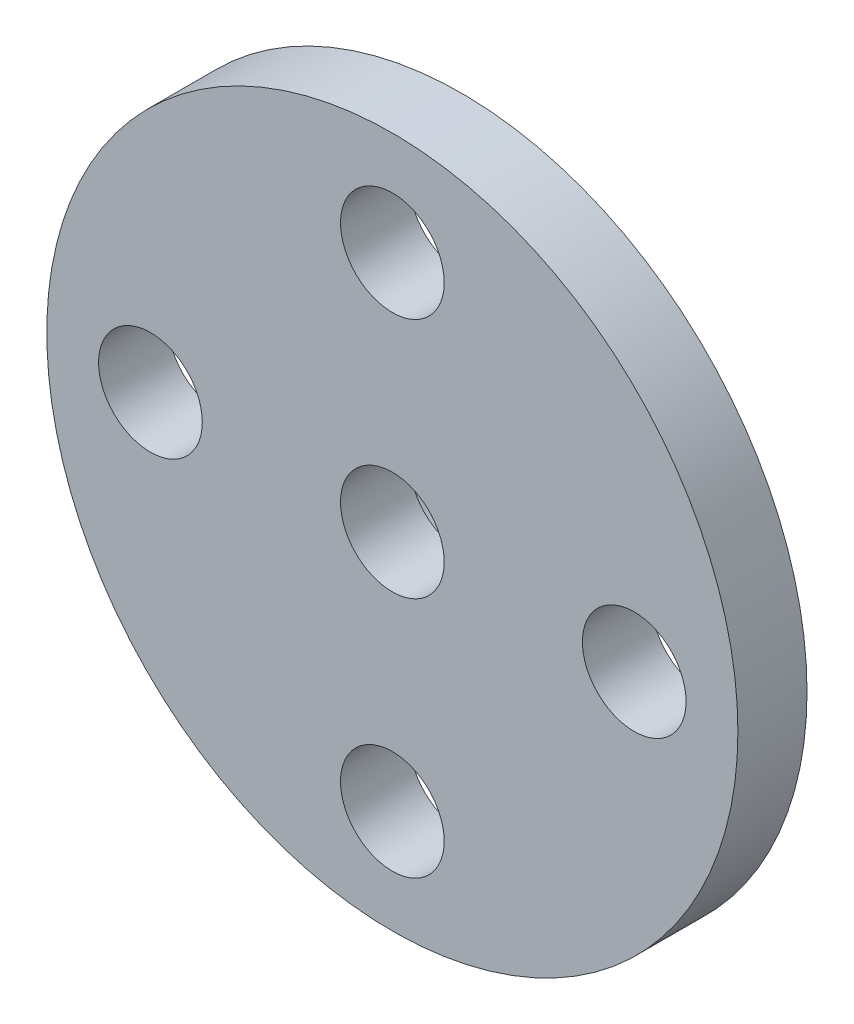
ISO-10303-21;
HEADER;
FILE_DESCRIPTION(('STEP AP214'),'2;1');
FILE_NAME('part.step','',(''),(''),'','','');
FILE_SCHEMA(('AUTOMOTIVE_DESIGN { 1 0 10303 214 1 1 1 1 }'));
ENDSEC;
DATA;
#1=APPLICATION_CONTEXT('core data for automotive mechanical design processes');
#2=APPLICATION_PROTOCOL_DEFINITION('international standard','automotive_design',2000,#1);
#3=PRODUCT_CONTEXT('',#1,'mechanical');
#4=PRODUCT('Part','Part','',(#3));
#5=PRODUCT_RELATED_PRODUCT_CATEGORY('part','',(#4));
#6=PRODUCT_DEFINITION_FORMATION('','',#4);
#7=PRODUCT_DEFINITION_CONTEXT('part definition',#1,'design');
#8=PRODUCT_DEFINITION('design','',#6,#7);
#9=PRODUCT_DEFINITION_SHAPE('','',#8);
#10=(LENGTH_UNIT() NAMED_UNIT(*) SI_UNIT(.MILLI.,.METRE.));
#11=(NAMED_UNIT(*) PLANE_ANGLE_UNIT() SI_UNIT($,.RADIAN.));
#12=(NAMED_UNIT(*) SI_UNIT($,.STERADIAN.) SOLID_ANGLE_UNIT());
#13=UNCERTAINTY_MEASURE_WITH_UNIT(LENGTH_MEASURE(1.E-05),#10,'distance_accuracy_value','');
#14=(GEOMETRIC_REPRESENTATION_CONTEXT(3) GLOBAL_UNCERTAINTY_ASSIGNED_CONTEXT((#13)) GLOBAL_UNIT_ASSIGNED_CONTEXT((#10,
#11,#12)) REPRESENTATION_CONTEXT('',''));
#15=CARTESIAN_POINT('',(0.,0.,0.));
#16=DIRECTION('',(0.,0.,1.));
#17=DIRECTION('',(1.,0.,0.));
#18=AXIS2_PLACEMENT_3D('',#15,#16,#17);
#19=CARTESIAN_POINT('',(0.,0.,0.));
#20=DIRECTION('',(0.,0.,1.));
#21=DIRECTION('',(1.,0.,0.));
#22=AXIS2_PLACEMENT_3D('',#19,#20,#21);
#23=PLANE('',#22);
#24=CARTESIAN_POINT('',(0.,0.,0.));
#25=DIRECTION('',(0.,0.,1.));
#26=DIRECTION('',(1.,0.,0.));
#27=AXIS2_PLACEMENT_3D('',#24,#25,#26);
#28=CIRCLE('',#27,1.5);
#29=CARTESIAN_POINT('',(1.5,0.,0.));
#30=VERTEX_POINT('',#29);
#31=EDGE_CURVE('E52',#30,#30,#28,.T.);
#32=ORIENTED_EDGE('',*,*,#31,.T.);
#33=EDGE_LOOP('',(#32));
#34=FACE_BOUND('',#33,.T.);
#35=CARTESIAN_POINT('',(0.,0.,0.));
#36=DIRECTION('',(0.,0.,-1.));
#37=DIRECTION('',(-1.,0.,0.));
#38=AXIS2_PLACEMENT_3D('',#35,#36,#37);
#39=CIRCLE('',#38,3.);
#40=CARTESIAN_POINT('',(-3.,0.,0.));
#41=VERTEX_POINT('',#40);
#42=EDGE_CURVE('E85',#41,#41,#39,.T.);
#43=ORIENTED_EDGE('',*,*,#42,.T.);
#44=EDGE_LOOP('',(#43));
#45=FACE_BOUND('',#44,.T.);
#46=ADVANCED_FACE('F34',(#34,#45),#23,.F.);
#47=CARTESIAN_POINT('',(0.,0.,2.));
#48=DIRECTION('',(0.,0.,1.));
#49=DIRECTION('',(1.,0.,0.));
#50=AXIS2_PLACEMENT_3D('',#47,#48,#49);
#51=PLANE('',#50);
#52=CARTESIAN_POINT('',(1.96380207734619E-13,-7.,2.));
#53=DIRECTION('',(0.,0.,1.));
#54=DIRECTION('',(1.,0.,0.));
#55=AXIS2_PLACEMENT_3D('',#52,#53,#54);
#56=CIRCLE('',#55,1.50000000000023);
#57=CARTESIAN_POINT('',(1.50000000000043,-7.,2.));
#58=VERTEX_POINT('',#57);
#59=EDGE_CURVE('E67',#58,#58,#56,.T.);
#60=ORIENTED_EDGE('',*,*,#59,.F.);
#61=EDGE_LOOP('',(#60));
#62=FACE_BOUND('',#61,.T.);
#63=CARTESIAN_POINT('',(0.,7.,2.));
#64=DIRECTION('',(0.,0.,1.));
#65=DIRECTION('',(1.,0.,0.));
#66=AXIS2_PLACEMENT_3D('',#63,#64,#65);
#67=CIRCLE('',#66,1.5);
#68=CARTESIAN_POINT('',(1.5,7.,2.));
#69=VERTEX_POINT('',#68);
#70=EDGE_CURVE('E55',#69,#69,#67,.T.);
#71=ORIENTED_EDGE('',*,*,#70,.F.);
#72=EDGE_LOOP('',(#71));
#73=FACE_BOUND('',#72,.T.);
#74=CARTESIAN_POINT('',(0.,0.,2.));
#75=DIRECTION('',(0.,0.,1.));
#76=DIRECTION('',(1.,0.,0.));
#77=AXIS2_PLACEMENT_3D('',#74,#75,#76);
#78=CIRCLE('',#77,10.);
#79=CARTESIAN_POINT('',(10.,0.,2.));
#80=VERTEX_POINT('',#79);
#81=EDGE_CURVE('E41',#80,#80,#78,.T.);
#82=ORIENTED_EDGE('',*,*,#81,.T.);
#83=EDGE_LOOP('',(#82));
#84=FACE_BOUND('',#83,.T.);
#85=CARTESIAN_POINT('',(0.,0.,2.));
#86=DIRECTION('',(0.,0.,1.));
#87=DIRECTION('',(1.,0.,0.));
#88=AXIS2_PLACEMENT_3D('',#85,#86,#87);
#89=CIRCLE('',#88,1.5);
#90=CARTESIAN_POINT('',(1.5,0.,2.));
#91=VERTEX_POINT('',#90);
#92=EDGE_CURVE('E50',#91,#91,#89,.T.);
#93=ORIENTED_EDGE('',*,*,#92,.F.);
#94=EDGE_LOOP('',(#93));
#95=FACE_BOUND('',#94,.T.);
#96=CARTESIAN_POINT('',(7.,0.,2.));
#97=DIRECTION('',(0.,0.,1.));
#98=DIRECTION('',(1.,0.,0.));
#99=AXIS2_PLACEMENT_3D('',#96,#97,#98);
#100=CIRCLE('',#99,1.5);
#101=CARTESIAN_POINT('',(8.5,0.,2.));
#102=VERTEX_POINT('',#101);
#103=EDGE_CURVE('E61',#102,#102,#100,.T.);
#104=ORIENTED_EDGE('',*,*,#103,.F.);
#105=EDGE_LOOP('',(#104));
#106=FACE_BOUND('',#105,.T.);
#107=CARTESIAN_POINT('',(-6.9999999999999,0.,2.));
#108=DIRECTION('',(0.,0.,1.));
#109=DIRECTION('',(1.,0.,0.));
#110=AXIS2_PLACEMENT_3D('',#107,#108,#109);
#111=CIRCLE('',#110,1.50000000000019);
#112=CARTESIAN_POINT('',(-5.49999999999971,0.,2.));
#113=VERTEX_POINT('',#112);
#114=EDGE_CURVE('E73',#113,#113,#111,.T.);
#115=ORIENTED_EDGE('',*,*,#114,.F.);
#116=EDGE_LOOP('',(#115));
#117=FACE_BOUND('',#116,.T.);
#118=ADVANCED_FACE('F111',(#62,#73,#84,#95,#106,#117),#51,.T.);
#119=CARTESIAN_POINT('',(0.,0.,0.));
#120=DIRECTION('',(0.,0.,1.));
#121=DIRECTION('',(1.,0.,0.));
#122=AXIS2_PLACEMENT_3D('',#119,#120,#121);
#123=CIRCLE('',#122,4.5);
#124=CARTESIAN_POINT('',(4.5,0.,0.));
#125=VERTEX_POINT('',#124);
#126=EDGE_CURVE('E10',#125,#125,#123,.F.);
#127=ORIENTED_EDGE('',*,*,#126,.F.);
#128=EDGE_LOOP('',(#127));
#129=FACE_BOUND('',#128,.T.);
#130=CARTESIAN_POINT('',(0.,0.,0.));
#131=DIRECTION('',(0.,0.,1.));
#132=DIRECTION('',(1.,0.,0.));
#133=AXIS2_PLACEMENT_3D('',#130,#131,#132);
#134=CIRCLE('',#133,10.);
#135=CARTESIAN_POINT('',(10.,0.,0.));
#136=VERTEX_POINT('',#135);
#137=EDGE_CURVE('E45',#136,#136,#134,.T.);
#138=ORIENTED_EDGE('',*,*,#137,.F.);
#139=EDGE_LOOP('',(#138));
#140=FACE_BOUND('',#139,.T.);
#141=CARTESIAN_POINT('',(0.,7.,0.));
#142=DIRECTION('',(0.,0.,1.));
#143=DIRECTION('',(1.,0.,0.));
#144=AXIS2_PLACEMENT_3D('',#141,#142,#143);
#145=CIRCLE('',#144,1.5);
#146=CARTESIAN_POINT('',(1.5,7.,0.));
#147=VERTEX_POINT('',#146);
#148=EDGE_CURVE('E58',#147,#147,#145,.T.);
#149=ORIENTED_EDGE('',*,*,#148,.T.);
#150=EDGE_LOOP('',(#149));
#151=FACE_BOUND('',#150,.T.);
#152=CARTESIAN_POINT('',(7.,0.,0.));
#153=DIRECTION('',(0.,0.,1.));
#154=DIRECTION('',(1.,0.,0.));
#155=AXIS2_PLACEMENT_3D('',#152,#153,#154);
#156=CIRCLE('',#155,1.5);
#157=CARTESIAN_POINT('',(8.5,0.,0.));
#158=VERTEX_POINT('',#157);
#159=EDGE_CURVE('E64',#158,#158,#156,.T.);
#160=ORIENTED_EDGE('',*,*,#159,.T.);
#161=EDGE_LOOP('',(#160));
#162=FACE_BOUND('',#161,.T.);
#163=CARTESIAN_POINT('',(1.96380207734619E-13,-7.,0.));
#164=DIRECTION('',(0.,0.,1.));
#165=DIRECTION('',(1.,0.,0.));
#166=AXIS2_PLACEMENT_3D('',#163,#164,#165);
#167=CIRCLE('',#166,1.50000000000023);
#168=CARTESIAN_POINT('',(1.50000000000043,-7.,0.));
#169=VERTEX_POINT('',#168);
#170=EDGE_CURVE('E70',#169,#169,#167,.T.);
#171=ORIENTED_EDGE('',*,*,#170,.T.);
#172=EDGE_LOOP('',(#171));
#173=FACE_BOUND('',#172,.T.);
#174=CARTESIAN_POINT('',(-6.9999999999999,0.,0.));
#175=DIRECTION('',(0.,0.,1.));
#176=DIRECTION('',(1.,0.,0.));
#177=AXIS2_PLACEMENT_3D('',#174,#175,#176);
#178=CIRCLE('',#177,1.50000000000019);
#179=CARTESIAN_POINT('',(-5.49999999999971,0.,0.));
#180=VERTEX_POINT('',#179);
#181=EDGE_CURVE('E76',#180,#180,#178,.T.);
#182=ORIENTED_EDGE('',*,*,#181,.T.);
#183=EDGE_LOOP('',(#182));
#184=FACE_BOUND('',#183,.T.);
#185=ADVANCED_FACE('F113',(#129,#140,#151,#162,#173,#184),#23,.F.);
#186=CARTESIAN_POINT('',(0.,0.,2.));
#187=DIRECTION('',(0.,0.,-1.));
#188=DIRECTION('',(-1.,0.,0.));
#189=AXIS2_PLACEMENT_3D('',#186,#187,#188);
#190=CYLINDRICAL_SURFACE('',#189,10.);
#191=ORIENTED_EDGE('',*,*,#81,.F.);
#192=EDGE_LOOP('',(#191));
#193=FACE_BOUND('',#192,.T.);
#194=ORIENTED_EDGE('',*,*,#137,.T.);
#195=EDGE_LOOP('',(#194));
#196=FACE_BOUND('',#195,.T.);
#197=ADVANCED_FACE('F36',(#193,#196),#190,.T.);
#198=CARTESIAN_POINT('',(0.,0.,2.));
#199=DIRECTION('',(0.,0.,-1.));
#200=DIRECTION('',(-1.,0.,0.));
#201=AXIS2_PLACEMENT_3D('',#198,#199,#200);
#202=CYLINDRICAL_SURFACE('',#201,1.5);
#203=ORIENTED_EDGE('',*,*,#92,.T.);
#204=EDGE_LOOP('',(#203));
#205=FACE_BOUND('',#204,.T.);
#206=ORIENTED_EDGE('',*,*,#31,.F.);
#207=EDGE_LOOP('',(#206));
#208=FACE_BOUND('',#207,.T.);
#209=ADVANCED_FACE('F125',(#205,#208),#202,.F.);
#210=CARTESIAN_POINT('',(0.,7.,2.));
#211=DIRECTION('',(0.,0.,-1.));
#212=DIRECTION('',(-1.,0.,0.));
#213=AXIS2_PLACEMENT_3D('',#210,#211,#212);
#214=CYLINDRICAL_SURFACE('',#213,1.5);
#215=ORIENTED_EDGE('',*,*,#70,.T.);
#216=EDGE_LOOP('',(#215));
#217=FACE_BOUND('',#216,.T.);
#218=ORIENTED_EDGE('',*,*,#148,.F.);
#219=EDGE_LOOP('',(#218));
#220=FACE_BOUND('',#219,.T.);
#221=ADVANCED_FACE('F146',(#217,#220),#214,.F.);
#222=CARTESIAN_POINT('',(7.,0.,2.));
#223=DIRECTION('',(0.,0.,-1.));
#224=DIRECTION('',(-1.,0.,0.));
#225=AXIS2_PLACEMENT_3D('',#222,#223,#224);
#226=CYLINDRICAL_SURFACE('',#225,1.5);
#227=ORIENTED_EDGE('',*,*,#103,.T.);
#228=EDGE_LOOP('',(#227));
#229=FACE_BOUND('',#228,.T.);
#230=ORIENTED_EDGE('',*,*,#159,.F.);
#231=EDGE_LOOP('',(#230));
#232=FACE_BOUND('',#231,.T.);
#233=ADVANCED_FACE('F140',(#229,#232),#226,.F.);
#234=CARTESIAN_POINT('',(1.96380207734619E-13,-7.,2.));
#235=DIRECTION('',(0.,0.,-1.));
#236=DIRECTION('',(-1.,0.,0.));
#237=AXIS2_PLACEMENT_3D('',#234,#235,#236);
#238=CYLINDRICAL_SURFACE('',#237,1.50000000000023);
#239=ORIENTED_EDGE('',*,*,#59,.T.);
#240=EDGE_LOOP('',(#239));
#241=FACE_BOUND('',#240,.T.);
#242=ORIENTED_EDGE('',*,*,#170,.F.);
#243=EDGE_LOOP('',(#242));
#244=FACE_BOUND('',#243,.T.);
#245=ADVANCED_FACE('F106',(#241,#244),#238,.F.);
#246=CARTESIAN_POINT('',(-6.9999999999999,0.,2.));
#247=DIRECTION('',(0.,0.,-1.));
#248=DIRECTION('',(-1.,0.,0.));
#249=AXIS2_PLACEMENT_3D('',#246,#247,#248);
#250=CYLINDRICAL_SURFACE('',#249,1.50000000000019);
#251=ORIENTED_EDGE('',*,*,#114,.T.);
#252=EDGE_LOOP('',(#251));
#253=FACE_BOUND('',#252,.T.);
#254=ORIENTED_EDGE('',*,*,#181,.F.);
#255=EDGE_LOOP('',(#254));
#256=FACE_BOUND('',#255,.T.);
#257=ADVANCED_FACE('F97',(#253,#256),#250,.F.);
#258=CARTESIAN_POINT('',(0.,0.,-2.));
#259=DIRECTION('',(0.,0.,-1.));
#260=DIRECTION('',(-1.,0.,0.));
#261=AXIS2_PLACEMENT_3D('',#258,#259,#260);
#262=PLANE('',#261);
#263=CARTESIAN_POINT('',(0.,0.,-2.));
#264=DIRECTION('',(0.,0.,-1.));
#265=DIRECTION('',(-1.,0.,0.));
#266=AXIS2_PLACEMENT_3D('',#263,#264,#265);
#267=CIRCLE('',#266,4.5);
#268=CARTESIAN_POINT('',(-4.5,0.,-2.));
#269=VERTEX_POINT('',#268);
#270=EDGE_CURVE('E79',#269,#269,#267,.T.);
#271=ORIENTED_EDGE('',*,*,#270,.T.);
#272=EDGE_LOOP('',(#271));
#273=FACE_BOUND('',#272,.T.);
#274=CARTESIAN_POINT('',(0.,0.,-2.));
#275=DIRECTION('',(0.,0.,-1.));
#276=DIRECTION('',(-1.,0.,0.));
#277=AXIS2_PLACEMENT_3D('',#274,#275,#276);
#278=CIRCLE('',#277,3.);
#279=CARTESIAN_POINT('',(-3.,0.,-2.));
#280=VERTEX_POINT('',#279);
#281=EDGE_CURVE('E84',#280,#280,#278,.T.);
#282=ORIENTED_EDGE('',*,*,#281,.F.);
#283=EDGE_LOOP('',(#282));
#284=FACE_BOUND('',#283,.T.);
#285=ADVANCED_FACE('F94',(#273,#284),#262,.T.);
#286=CARTESIAN_POINT('',(0.,0.,-2.));
#287=DIRECTION('',(0.,0.,1.));
#288=DIRECTION('',(1.,0.,0.));
#289=AXIS2_PLACEMENT_3D('',#286,#287,#288);
#290=CYLINDRICAL_SURFACE('',#289,4.5);
#291=ORIENTED_EDGE('',*,*,#270,.F.);
#292=EDGE_LOOP('',(#291));
#293=FACE_BOUND('',#292,.T.);
#294=ORIENTED_EDGE('',*,*,#126,.T.);
#295=EDGE_LOOP('',(#294));
#296=FACE_BOUND('',#295,.T.);
#297=ADVANCED_FACE('F96',(#293,#296),#290,.T.);
#298=CARTESIAN_POINT('',(0.,0.,-2.));
#299=DIRECTION('',(0.,0.,1.));
#300=DIRECTION('',(1.,0.,0.));
#301=AXIS2_PLACEMENT_3D('',#298,#299,#300);
#302=CYLINDRICAL_SURFACE('',#301,3.);
#303=ORIENTED_EDGE('',*,*,#281,.T.);
#304=EDGE_LOOP('',(#303));
#305=FACE_BOUND('',#304,.T.);
#306=ORIENTED_EDGE('',*,*,#42,.F.);
#307=EDGE_LOOP('',(#306));
#308=FACE_BOUND('',#307,.T.);
#309=ADVANCED_FACE('F91',(#305,#308),#302,.F.);
#310=CLOSED_SHELL('',(#46,#118,#185,#197,#209,#221,#233,#245,#257,#285,#297,#309));
#311=MANIFOLD_SOLID_BREP('B2',#310);
#312=ADVANCED_BREP_SHAPE_REPRESENTATION('',(#18,#311),#14);
#313=SHAPE_DEFINITION_REPRESENTATION(#9,#312);
ENDSEC;
END-ISO-10303-21;
